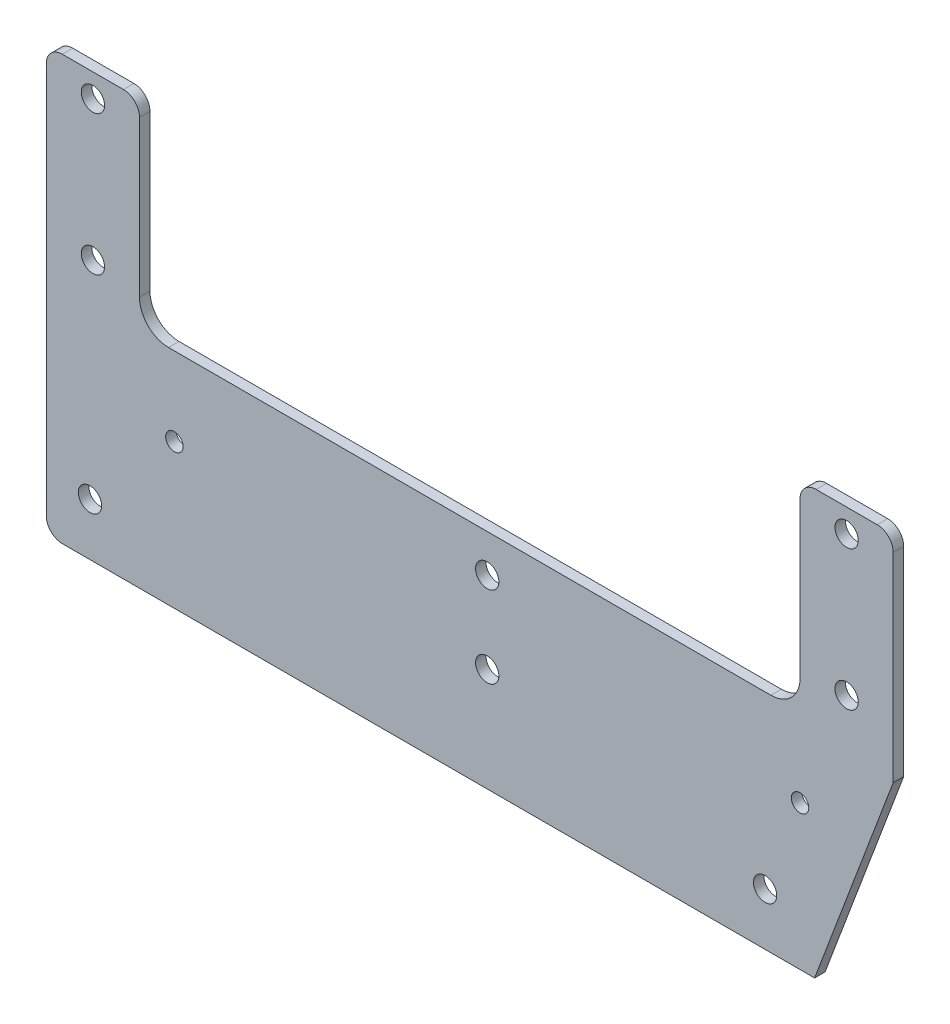
ISO-10303-21;
HEADER;
FILE_DESCRIPTION(('STEP AP214'),'2;1');
FILE_NAME('part.step','',(''),(''),'','','');
FILE_SCHEMA(('AUTOMOTIVE_DESIGN { 1 0 10303 214 1 1 1 1 }'));
ENDSEC;
DATA;
#1=APPLICATION_CONTEXT('core data for automotive mechanical design processes');
#2=APPLICATION_PROTOCOL_DEFINITION('international standard','automotive_design',2000,#1);
#3=PRODUCT_CONTEXT('',#1,'mechanical');
#4=PRODUCT('Part','Part','',(#3));
#5=PRODUCT_RELATED_PRODUCT_CATEGORY('part','',(#4));
#6=PRODUCT_DEFINITION_FORMATION('','',#4);
#7=PRODUCT_DEFINITION_CONTEXT('part definition',#1,'design');
#8=PRODUCT_DEFINITION('design','',#6,#7);
#9=PRODUCT_DEFINITION_SHAPE('','',#8);
#10=(LENGTH_UNIT() NAMED_UNIT(*) SI_UNIT(.MILLI.,.METRE.));
#11=(NAMED_UNIT(*) PLANE_ANGLE_UNIT() SI_UNIT($,.RADIAN.));
#12=(NAMED_UNIT(*) SI_UNIT($,.STERADIAN.) SOLID_ANGLE_UNIT());
#13=UNCERTAINTY_MEASURE_WITH_UNIT(LENGTH_MEASURE(1.E-05),#10,'distance_accuracy_value','');
#14=(GEOMETRIC_REPRESENTATION_CONTEXT(3) GLOBAL_UNCERTAINTY_ASSIGNED_CONTEXT((#13)) GLOBAL_UNIT_ASSIGNED_CONTEXT((#10,
#11,#12)) REPRESENTATION_CONTEXT('',''));
#15=CARTESIAN_POINT('',(0.,0.,0.));
#16=DIRECTION('',(0.,0.,1.));
#17=DIRECTION('',(1.,0.,0.));
#18=AXIS2_PLACEMENT_3D('',#15,#16,#17);
#19=CARTESIAN_POINT('',(0.,0.,1.8));
#20=DIRECTION('',(0.,0.,1.));
#21=DIRECTION('',(1.,0.,0.));
#22=AXIS2_PLACEMENT_3D('',#19,#20,#21);
#23=PLANE('',#22);
#24=CARTESIAN_POINT('',(-14.,44.,1.8));
#25=DIRECTION('',(0.,0.,1.));
#26=DIRECTION('',(1.,0.,0.));
#27=AXIS2_PLACEMENT_3D('',#24,#25,#26);
#28=CIRCLE('',#27,2.);
#29=CARTESIAN_POINT('',(-12.,44.,1.8));
#30=VERTEX_POINT('',#29);
#31=EDGE_CURVE('E620',#30,#30,#28,.T.);
#32=ORIENTED_EDGE('',*,*,#31,.F.);
#33=EDGE_LOOP('',(#32));
#34=FACE_BOUND('',#33,.T.);
#35=CARTESIAN_POINT('',(53.725,7.,1.8));
#36=DIRECTION('',(0.,0.,1.));
#37=DIRECTION('',(1.,0.,0.));
#38=AXIS2_PLACEMENT_3D('',#35,#36,#37);
#39=CIRCLE('',#38,2.);
#40=CARTESIAN_POINT('',(55.725,7.,1.8));
#41=VERTEX_POINT('',#40);
#42=EDGE_CURVE('E608',#41,#41,#39,.T.);
#43=ORIENTED_EDGE('',*,*,#42,.F.);
#44=EDGE_LOOP('',(#43));
#45=FACE_BOUND('',#44,.T.);
#46=CARTESIAN_POINT('',(101.45,-15.8,1.8));
#47=DIRECTION('',(0.,0.,1.));
#48=DIRECTION('',(1.,0.,0.));
#49=AXIS2_PLACEMENT_3D('',#46,#47,#48);
#50=CIRCLE('',#49,2.);
#51=CARTESIAN_POINT('',(103.45,-15.8,1.8));
#52=VERTEX_POINT('',#51);
#53=EDGE_CURVE('E596',#52,#52,#50,.T.);
#54=ORIENTED_EDGE('',*,*,#53,.F.);
#55=EDGE_LOOP('',(#54));
#56=FACE_BOUND('',#55,.T.);
#57=CARTESIAN_POINT('',(115.45,20.,1.8));
#58=DIRECTION('',(0.,0.,1.));
#59=DIRECTION('',(1.,0.,0.));
#60=AXIS2_PLACEMENT_3D('',#57,#58,#59);
#61=CIRCLE('',#60,2.);
#62=CARTESIAN_POINT('',(117.45,20.,1.8));
#63=VERTEX_POINT('',#62);
#64=EDGE_CURVE('E584',#63,#63,#61,.T.);
#65=ORIENTED_EDGE('',*,*,#64,.F.);
#66=EDGE_LOOP('',(#65));
#67=FACE_BOUND('',#66,.T.);
#68=CARTESIAN_POINT('',(107.45,0.,1.8));
#69=DIRECTION('',(0.,0.,1.));
#70=DIRECTION('',(1.,0.,0.));
#71=AXIS2_PLACEMENT_3D('',#68,#69,#70);
#72=CIRCLE('',#71,1.5);
#73=CARTESIAN_POINT('',(108.95,0.,1.8));
#74=VERTEX_POINT('',#73);
#75=EDGE_CURVE('E196',#74,#74,#72,.T.);
#76=ORIENTED_EDGE('',*,*,#75,.F.);
#77=EDGE_LOOP('',(#76));
#78=FACE_BOUND('',#77,.T.);
#79=DIRECTION('',(0.,1.,0.));
#80=VECTOR('',#79,1.);
#81=CARTESIAN_POINT('',(123.45,11.,1.8));
#82=LINE('',#81,#80);
#83=CARTESIAN_POINT('',(123.45,11.,1.8));
#84=VERTEX_POINT('',#83);
#85=CARTESIAN_POINT('',(123.45,45.25,1.8));
#86=VERTEX_POINT('',#85);
#87=EDGE_CURVE('E175',#84,#86,#82,.T.);
#88=ORIENTED_EDGE('',*,*,#87,.T.);
#89=CARTESIAN_POINT('',(120.7,45.25,1.8));
#90=DIRECTION('',(0.,0.,1.));
#91=DIRECTION('',(1.,0.,0.));
#92=AXIS2_PLACEMENT_3D('',#89,#90,#91);
#93=CIRCLE('',#92,2.75);
#94=CARTESIAN_POINT('',(120.7,48.,1.8));
#95=VERTEX_POINT('',#94);
#96=EDGE_CURVE('E241',#86,#95,#93,.T.);
#97=ORIENTED_EDGE('',*,*,#96,.T.);
#98=DIRECTION('',(-1.,0.,0.));
#99=VECTOR('',#98,1.);
#100=CARTESIAN_POINT('',(123.45,48.,1.8));
#101=LINE('',#100,#99);
#102=CARTESIAN_POINT('',(110.2,48.,1.8));
#103=VERTEX_POINT('',#102);
#104=EDGE_CURVE('E177',#95,#103,#101,.T.);
#105=ORIENTED_EDGE('',*,*,#104,.T.);
#106=CARTESIAN_POINT('',(110.2,45.25,1.8));
#107=DIRECTION('',(0.,0.,1.));
#108=DIRECTION('',(1.,0.,0.));
#109=AXIS2_PLACEMENT_3D('',#106,#107,#108);
#110=CIRCLE('',#109,2.75);
#111=CARTESIAN_POINT('',(107.45,45.25,1.8));
#112=VERTEX_POINT('',#111);
#113=EDGE_CURVE('E239',#103,#112,#110,.T.);
#114=ORIENTED_EDGE('',*,*,#113,.T.);
#115=DIRECTION('',(0.,-1.,0.));
#116=VECTOR('',#115,1.);
#117=CARTESIAN_POINT('',(107.45,48.,1.8));
#118=LINE('',#117,#116);
#119=CARTESIAN_POINT('',(107.45,18.5,1.8));
#120=VERTEX_POINT('',#119);
#121=EDGE_CURVE('E183',#112,#120,#118,.T.);
#122=ORIENTED_EDGE('',*,*,#121,.T.);
#123=CARTESIAN_POINT('',(102.45,18.5,1.8));
#124=DIRECTION('',(0.,0.,1.));
#125=DIRECTION('',(1.,0.,0.));
#126=AXIS2_PLACEMENT_3D('',#123,#124,#125);
#127=CIRCLE('',#126,5.);
#128=CARTESIAN_POINT('',(102.45,13.5,1.8));
#129=VERTEX_POINT('',#128);
#130=EDGE_CURVE('E11',#120,#129,#127,.F.);
#131=ORIENTED_EDGE('',*,*,#130,.T.);
#132=DIRECTION('',(-1.,0.,0.));
#133=VECTOR('',#132,1.);
#134=CARTESIAN_POINT('',(107.45,13.5,1.8));
#135=LINE('',#134,#133);
#136=CARTESIAN_POINT('',(-1.,13.5,1.8));
#137=VERTEX_POINT('',#136);
#138=EDGE_CURVE('E185',#129,#137,#135,.T.);
#139=ORIENTED_EDGE('',*,*,#138,.T.);
#140=CARTESIAN_POINT('',(-1.00000000000001,18.5,1.8));
#141=DIRECTION('',(0.,0.,1.));
#142=DIRECTION('',(1.,0.,0.));
#143=AXIS2_PLACEMENT_3D('',#140,#141,#142);
#144=CIRCLE('',#143,5.);
#145=CARTESIAN_POINT('',(-6.00000000000001,18.5,1.8));
#146=VERTEX_POINT('',#145);
#147=EDGE_CURVE('E272',#137,#146,#144,.F.);
#148=ORIENTED_EDGE('',*,*,#147,.T.);
#149=DIRECTION('',(0.,1.,0.));
#150=VECTOR('',#149,1.);
#151=CARTESIAN_POINT('',(-6.00000000000001,13.5,1.8));
#152=LINE('',#151,#150);
#153=CARTESIAN_POINT('',(-6.,45.25,1.8));
#154=VERTEX_POINT('',#153);
#155=EDGE_CURVE('E188',#146,#154,#152,.T.);
#156=ORIENTED_EDGE('',*,*,#155,.T.);
#157=CARTESIAN_POINT('',(-8.75,45.25,1.8));
#158=DIRECTION('',(0.,0.,1.));
#159=DIRECTION('',(1.,0.,0.));
#160=AXIS2_PLACEMENT_3D('',#157,#158,#159);
#161=CIRCLE('',#160,2.75);
#162=CARTESIAN_POINT('',(-8.75,48.,1.8));
#163=VERTEX_POINT('',#162);
#164=EDGE_CURVE('E237',#154,#163,#161,.T.);
#165=ORIENTED_EDGE('',*,*,#164,.T.);
#166=DIRECTION('',(-1.,0.,0.));
#167=VECTOR('',#166,1.);
#168=CARTESIAN_POINT('',(-6.,48.,1.8));
#169=LINE('',#168,#167);
#170=CARTESIAN_POINT('',(-19.25,48.,1.8));
#171=VERTEX_POINT('',#170);
#172=EDGE_CURVE('E190',#163,#171,#169,.T.);
#173=ORIENTED_EDGE('',*,*,#172,.T.);
#174=CARTESIAN_POINT('',(-19.25,45.25,1.8));
#175=DIRECTION('',(0.,0.,1.));
#176=DIRECTION('',(1.,0.,0.));
#177=AXIS2_PLACEMENT_3D('',#174,#175,#176);
#178=CIRCLE('',#177,2.75);
#179=CARTESIAN_POINT('',(-22.,45.25,1.8));
#180=VERTEX_POINT('',#179);
#181=EDGE_CURVE('E235',#171,#180,#178,.T.);
#182=ORIENTED_EDGE('',*,*,#181,.T.);
#183=DIRECTION('',(0.,-1.,0.));
#184=VECTOR('',#183,1.);
#185=CARTESIAN_POINT('',(-22.,48.,1.8));
#186=LINE('',#185,#184);
#187=CARTESIAN_POINT('',(-22.,-22.05,1.8));
#188=VERTEX_POINT('',#187);
#189=EDGE_CURVE('E160',#180,#188,#186,.T.);
#190=ORIENTED_EDGE('',*,*,#189,.T.);
#191=CARTESIAN_POINT('',(-19.25,-22.05,1.8));
#192=DIRECTION('',(0.,0.,1.));
#193=DIRECTION('',(1.,0.,0.));
#194=AXIS2_PLACEMENT_3D('',#191,#192,#193);
#195=CIRCLE('',#194,2.75);
#196=CARTESIAN_POINT('',(-19.25,-24.8,1.8));
#197=VERTEX_POINT('',#196);
#198=EDGE_CURVE('E156',#188,#197,#195,.T.);
#199=ORIENTED_EDGE('',*,*,#198,.T.);
#200=DIRECTION('',(1.,0.,0.));
#201=VECTOR('',#200,1.);
#202=CARTESIAN_POINT('',(-22.,-24.8,1.8));
#203=LINE('',#202,#201);
#204=CARTESIAN_POINT('',(109.95,-24.8,1.8));
#205=VERTEX_POINT('',#204);
#206=EDGE_CURVE('E147',#197,#205,#203,.T.);
#207=ORIENTED_EDGE('',*,*,#206,.T.);
#208=DIRECTION('',(0.352841408008284,0.935683141236782,0.));
#209=VECTOR('',#208,1.);
#210=CARTESIAN_POINT('',(109.95,-24.8,1.8));
#211=LINE('',#210,#209);
#212=EDGE_CURVE('E152',#205,#84,#211,.T.);
#213=ORIENTED_EDGE('',*,*,#212,.T.);
#214=EDGE_LOOP('',(#88,#97,#105,#114,#122,#131,#139,#148,#156,#165,#173,#182,#190,#199,#207,#213));
#215=FACE_BOUND('',#214,.T.);
#216=CARTESIAN_POINT('',(0.,0.,1.8));
#217=DIRECTION('',(0.,0.,1.));
#218=DIRECTION('',(1.,0.,0.));
#219=AXIS2_PLACEMENT_3D('',#216,#217,#218);
#220=CIRCLE('',#219,1.5);
#221=CARTESIAN_POINT('',(1.5,0.,1.8));
#222=VERTEX_POINT('',#221);
#223=EDGE_CURVE('E578',#222,#222,#220,.T.);
#224=ORIENTED_EDGE('',*,*,#223,.F.);
#225=EDGE_LOOP('',(#224));
#226=FACE_BOUND('',#225,.T.);
#227=CARTESIAN_POINT('',(-14.,20.,1.8));
#228=DIRECTION('',(0.,0.,1.));
#229=DIRECTION('',(1.,0.,0.));
#230=AXIS2_PLACEMENT_3D('',#227,#228,#229);
#231=CIRCLE('',#230,2.);
#232=CARTESIAN_POINT('',(-12.,20.,1.8));
#233=VERTEX_POINT('',#232);
#234=EDGE_CURVE('E590',#233,#233,#231,.T.);
#235=ORIENTED_EDGE('',*,*,#234,.F.);
#236=EDGE_LOOP('',(#235));
#237=FACE_BOUND('',#236,.T.);
#238=CARTESIAN_POINT('',(-14.5,-15.8,1.8));
#239=DIRECTION('',(0.,0.,1.));
#240=DIRECTION('',(1.,0.,0.));
#241=AXIS2_PLACEMENT_3D('',#238,#239,#240);
#242=CIRCLE('',#241,2.);
#243=CARTESIAN_POINT('',(-12.5,-15.8,1.8));
#244=VERTEX_POINT('',#243);
#245=EDGE_CURVE('E602',#244,#244,#242,.T.);
#246=ORIENTED_EDGE('',*,*,#245,.F.);
#247=EDGE_LOOP('',(#246));
#248=FACE_BOUND('',#247,.T.);
#249=CARTESIAN_POINT('',(115.45,44.,1.8));
#250=DIRECTION('',(0.,0.,1.));
#251=DIRECTION('',(1.,0.,0.));
#252=AXIS2_PLACEMENT_3D('',#249,#250,#251);
#253=CIRCLE('',#252,2.);
#254=CARTESIAN_POINT('',(117.45,44.,1.8));
#255=VERTEX_POINT('',#254);
#256=EDGE_CURVE('E614',#255,#255,#253,.T.);
#257=ORIENTED_EDGE('',*,*,#256,.F.);
#258=EDGE_LOOP('',(#257));
#259=FACE_BOUND('',#258,.T.);
#260=CARTESIAN_POINT('',(53.725,-7.,1.8));
#261=DIRECTION('',(0.,0.,1.));
#262=DIRECTION('',(-1.,0.,0.));
#263=AXIS2_PLACEMENT_3D('',#260,#261,#262);
#264=CIRCLE('',#263,2.);
#265=CARTESIAN_POINT('',(51.725,-7.,1.8));
#266=VERTEX_POINT('',#265);
#267=EDGE_CURVE('E626',#266,#266,#264,.T.);
#268=ORIENTED_EDGE('',*,*,#267,.F.);
#269=EDGE_LOOP('',(#268));
#270=FACE_BOUND('',#269,.T.);
#271=ADVANCED_FACE('F35',(#34,#45,#56,#67,#78,#215,#226,#237,#248,#259,#270),#23,.T.);
#272=CARTESIAN_POINT('',(0.,0.,0.));
#273=DIRECTION('',(0.,0.,1.));
#274=DIRECTION('',(1.,0.,0.));
#275=AXIS2_PLACEMENT_3D('',#272,#273,#274);
#276=PLANE('',#275);
#277=DIRECTION('',(-1.,0.,0.));
#278=VECTOR('',#277,1.);
#279=CARTESIAN_POINT('',(123.45,48.,0.));
#280=LINE('',#279,#278);
#281=CARTESIAN_POINT('',(120.7,48.,0.));
#282=VERTEX_POINT('',#281);
#283=CARTESIAN_POINT('',(110.2,48.,0.));
#284=VERTEX_POINT('',#283);
#285=EDGE_CURVE('E203',#282,#284,#280,.T.);
#286=ORIENTED_EDGE('',*,*,#285,.F.);
#287=CARTESIAN_POINT('',(120.7,45.25,0.));
#288=DIRECTION('',(0.,0.,1.));
#289=DIRECTION('',(1.,0.,0.));
#290=AXIS2_PLACEMENT_3D('',#287,#288,#289);
#291=CIRCLE('',#290,2.75);
#292=CARTESIAN_POINT('',(123.45,45.25,0.));
#293=VERTEX_POINT('',#292);
#294=EDGE_CURVE('E230',#282,#293,#291,.F.);
#295=ORIENTED_EDGE('',*,*,#294,.T.);
#296=DIRECTION('',(0.,1.,0.));
#297=VECTOR('',#296,1.);
#298=CARTESIAN_POINT('',(123.45,11.,0.));
#299=LINE('',#298,#297);
#300=CARTESIAN_POINT('',(123.45,11.,0.));
#301=VERTEX_POINT('',#300);
#302=EDGE_CURVE('E200',#301,#293,#299,.T.);
#303=ORIENTED_EDGE('',*,*,#302,.F.);
#304=DIRECTION('',(0.352841408008284,0.935683141236782,0.));
#305=VECTOR('',#304,1.);
#306=CARTESIAN_POINT('',(109.95,-24.8,0.));
#307=LINE('',#306,#305);
#308=CARTESIAN_POINT('',(109.95,-24.8,0.));
#309=VERTEX_POINT('',#308);
#310=EDGE_CURVE('E198',#309,#301,#307,.T.);
#311=ORIENTED_EDGE('',*,*,#310,.F.);
#312=DIRECTION('',(1.,0.,0.));
#313=VECTOR('',#312,1.);
#314=CARTESIAN_POINT('',(-22.,-24.8,0.));
#315=LINE('',#314,#313);
#316=CARTESIAN_POINT('',(-19.25,-24.8,0.));
#317=VERTEX_POINT('',#316);
#318=EDGE_CURVE('E166',#317,#309,#315,.T.);
#319=ORIENTED_EDGE('',*,*,#318,.F.);
#320=CARTESIAN_POINT('',(-19.25,-22.05,0.));
#321=DIRECTION('',(0.,0.,1.));
#322=DIRECTION('',(1.,0.,0.));
#323=AXIS2_PLACEMENT_3D('',#320,#321,#322);
#324=CIRCLE('',#323,2.75);
#325=CARTESIAN_POINT('',(-22.,-22.05,0.));
#326=VERTEX_POINT('',#325);
#327=EDGE_CURVE('E221',#317,#326,#324,.F.);
#328=ORIENTED_EDGE('',*,*,#327,.T.);
#329=DIRECTION('',(0.,-1.,0.));
#330=VECTOR('',#329,1.);
#331=CARTESIAN_POINT('',(-22.,48.,0.));
#332=LINE('',#331,#330);
#333=CARTESIAN_POINT('',(-22.,45.25,0.));
#334=VERTEX_POINT('',#333);
#335=EDGE_CURVE('E193',#334,#326,#332,.T.);
#336=ORIENTED_EDGE('',*,*,#335,.F.);
#337=CARTESIAN_POINT('',(-19.25,45.25,0.));
#338=DIRECTION('',(0.,0.,1.));
#339=DIRECTION('',(1.,0.,0.));
#340=AXIS2_PLACEMENT_3D('',#337,#338,#339);
#341=CIRCLE('',#340,2.75);
#342=CARTESIAN_POINT('',(-19.25,48.,0.));
#343=VERTEX_POINT('',#342);
#344=EDGE_CURVE('E223',#334,#343,#341,.F.);
#345=ORIENTED_EDGE('',*,*,#344,.T.);
#346=DIRECTION('',(-1.,0.,0.));
#347=VECTOR('',#346,1.);
#348=CARTESIAN_POINT('',(-6.,48.,0.));
#349=LINE('',#348,#347);
#350=CARTESIAN_POINT('',(-8.75,48.,0.));
#351=VERTEX_POINT('',#350);
#352=EDGE_CURVE('E213',#351,#343,#349,.T.);
#353=ORIENTED_EDGE('',*,*,#352,.F.);
#354=CARTESIAN_POINT('',(-8.75,45.25,0.));
#355=DIRECTION('',(0.,0.,1.));
#356=DIRECTION('',(1.,0.,0.));
#357=AXIS2_PLACEMENT_3D('',#354,#355,#356);
#358=CIRCLE('',#357,2.75);
#359=CARTESIAN_POINT('',(-6.,45.25,0.));
#360=VERTEX_POINT('',#359);
#361=EDGE_CURVE('E225',#351,#360,#358,.F.);
#362=ORIENTED_EDGE('',*,*,#361,.T.);
#363=DIRECTION('',(0.,1.,0.));
#364=VECTOR('',#363,1.);
#365=CARTESIAN_POINT('',(-6.00000000000001,13.5,0.));
#366=LINE('',#365,#364);
#367=CARTESIAN_POINT('',(-6.00000000000001,18.5,0.));
#368=VERTEX_POINT('',#367);
#369=EDGE_CURVE('E211',#368,#360,#366,.T.);
#370=ORIENTED_EDGE('',*,*,#369,.F.);
#371=CARTESIAN_POINT('',(-1.00000000000001,18.5,0.));
#372=DIRECTION('',(0.,0.,1.));
#373=DIRECTION('',(1.,0.,0.));
#374=AXIS2_PLACEMENT_3D('',#371,#372,#373);
#375=CIRCLE('',#374,5.);
#376=CARTESIAN_POINT('',(-1.,13.5,0.));
#377=VERTEX_POINT('',#376);
#378=EDGE_CURVE('E270',#368,#377,#375,.T.);
#379=ORIENTED_EDGE('',*,*,#378,.T.);
#380=DIRECTION('',(-1.,0.,0.));
#381=VECTOR('',#380,1.);
#382=CARTESIAN_POINT('',(107.45,13.5,0.));
#383=LINE('',#382,#381);
#384=CARTESIAN_POINT('',(102.45,13.5,0.));
#385=VERTEX_POINT('',#384);
#386=EDGE_CURVE('E208',#385,#377,#383,.T.);
#387=ORIENTED_EDGE('',*,*,#386,.F.);
#388=CARTESIAN_POINT('',(102.45,18.5,0.));
#389=DIRECTION('',(0.,0.,1.));
#390=DIRECTION('',(1.,0.,0.));
#391=AXIS2_PLACEMENT_3D('',#388,#389,#390);
#392=CIRCLE('',#391,5.);
#393=CARTESIAN_POINT('',(107.45,18.5,0.));
#394=VERTEX_POINT('',#393);
#395=EDGE_CURVE('E43',#385,#394,#392,.T.);
#396=ORIENTED_EDGE('',*,*,#395,.T.);
#397=DIRECTION('',(0.,-1.,0.));
#398=VECTOR('',#397,1.);
#399=CARTESIAN_POINT('',(107.45,48.,0.));
#400=LINE('',#399,#398);
#401=CARTESIAN_POINT('',(107.45,45.25,0.));
#402=VERTEX_POINT('',#401);
#403=EDGE_CURVE('E206',#402,#394,#400,.T.);
#404=ORIENTED_EDGE('',*,*,#403,.F.);
#405=CARTESIAN_POINT('',(110.2,45.25,0.));
#406=DIRECTION('',(0.,0.,1.));
#407=DIRECTION('',(1.,0.,0.));
#408=AXIS2_PLACEMENT_3D('',#405,#406,#407);
#409=CIRCLE('',#408,2.75);
#410=EDGE_CURVE('E228',#402,#284,#409,.F.);
#411=ORIENTED_EDGE('',*,*,#410,.T.);
#412=EDGE_LOOP('',(#286,#295,#303,#311,#319,#328,#336,#345,#353,#362,#370,#379,#387,#396,#404,#411));
#413=FACE_BOUND('',#412,.T.);
#414=CARTESIAN_POINT('',(107.45,0.,0.));
#415=DIRECTION('',(0.,0.,1.));
#416=DIRECTION('',(1.,0.,0.));
#417=AXIS2_PLACEMENT_3D('',#414,#415,#416);
#418=CIRCLE('',#417,1.5);
#419=CARTESIAN_POINT('',(108.95,0.,0.));
#420=VERTEX_POINT('',#419);
#421=EDGE_CURVE('E575',#420,#420,#418,.T.);
#422=ORIENTED_EDGE('',*,*,#421,.T.);
#423=EDGE_LOOP('',(#422));
#424=FACE_BOUND('',#423,.T.);
#425=CARTESIAN_POINT('',(0.,0.,0.));
#426=DIRECTION('',(0.,0.,1.));
#427=DIRECTION('',(1.,0.,0.));
#428=AXIS2_PLACEMENT_3D('',#425,#426,#427);
#429=CIRCLE('',#428,1.5);
#430=CARTESIAN_POINT('',(1.5,0.,0.));
#431=VERTEX_POINT('',#430);
#432=EDGE_CURVE('E581',#431,#431,#429,.T.);
#433=ORIENTED_EDGE('',*,*,#432,.T.);
#434=EDGE_LOOP('',(#433));
#435=FACE_BOUND('',#434,.T.);
#436=CARTESIAN_POINT('',(115.45,20.,0.));
#437=DIRECTION('',(0.,0.,1.));
#438=DIRECTION('',(1.,0.,0.));
#439=AXIS2_PLACEMENT_3D('',#436,#437,#438);
#440=CIRCLE('',#439,2.);
#441=CARTESIAN_POINT('',(117.45,20.,0.));
#442=VERTEX_POINT('',#441);
#443=EDGE_CURVE('E587',#442,#442,#440,.T.);
#444=ORIENTED_EDGE('',*,*,#443,.T.);
#445=EDGE_LOOP('',(#444));
#446=FACE_BOUND('',#445,.T.);
#447=CARTESIAN_POINT('',(-14.,20.,0.));
#448=DIRECTION('',(0.,0.,1.));
#449=DIRECTION('',(1.,0.,0.));
#450=AXIS2_PLACEMENT_3D('',#447,#448,#449);
#451=CIRCLE('',#450,2.);
#452=CARTESIAN_POINT('',(-12.,20.,0.));
#453=VERTEX_POINT('',#452);
#454=EDGE_CURVE('E593',#453,#453,#451,.T.);
#455=ORIENTED_EDGE('',*,*,#454,.T.);
#456=EDGE_LOOP('',(#455));
#457=FACE_BOUND('',#456,.T.);
#458=CARTESIAN_POINT('',(101.45,-15.8,0.));
#459=DIRECTION('',(0.,0.,1.));
#460=DIRECTION('',(1.,0.,0.));
#461=AXIS2_PLACEMENT_3D('',#458,#459,#460);
#462=CIRCLE('',#461,2.);
#463=CARTESIAN_POINT('',(103.45,-15.8,0.));
#464=VERTEX_POINT('',#463);
#465=EDGE_CURVE('E599',#464,#464,#462,.T.);
#466=ORIENTED_EDGE('',*,*,#465,.T.);
#467=EDGE_LOOP('',(#466));
#468=FACE_BOUND('',#467,.T.);
#469=CARTESIAN_POINT('',(-14.5,-15.8,0.));
#470=DIRECTION('',(0.,0.,1.));
#471=DIRECTION('',(1.,0.,0.));
#472=AXIS2_PLACEMENT_3D('',#469,#470,#471);
#473=CIRCLE('',#472,2.);
#474=CARTESIAN_POINT('',(-12.5,-15.8,0.));
#475=VERTEX_POINT('',#474);
#476=EDGE_CURVE('E605',#475,#475,#473,.T.);
#477=ORIENTED_EDGE('',*,*,#476,.T.);
#478=EDGE_LOOP('',(#477));
#479=FACE_BOUND('',#478,.T.);
#480=CARTESIAN_POINT('',(53.725,7.,0.));
#481=DIRECTION('',(0.,0.,1.));
#482=DIRECTION('',(1.,0.,0.));
#483=AXIS2_PLACEMENT_3D('',#480,#481,#482);
#484=CIRCLE('',#483,2.);
#485=CARTESIAN_POINT('',(55.725,7.,0.));
#486=VERTEX_POINT('',#485);
#487=EDGE_CURVE('E611',#486,#486,#484,.T.);
#488=ORIENTED_EDGE('',*,*,#487,.T.);
#489=EDGE_LOOP('',(#488));
#490=FACE_BOUND('',#489,.T.);
#491=CARTESIAN_POINT('',(115.45,44.,0.));
#492=DIRECTION('',(0.,0.,1.));
#493=DIRECTION('',(1.,0.,0.));
#494=AXIS2_PLACEMENT_3D('',#491,#492,#493);
#495=CIRCLE('',#494,2.);
#496=CARTESIAN_POINT('',(117.45,44.,0.));
#497=VERTEX_POINT('',#496);
#498=EDGE_CURVE('E617',#497,#497,#495,.T.);
#499=ORIENTED_EDGE('',*,*,#498,.T.);
#500=EDGE_LOOP('',(#499));
#501=FACE_BOUND('',#500,.T.);
#502=CARTESIAN_POINT('',(-14.,44.,0.));
#503=DIRECTION('',(0.,0.,1.));
#504=DIRECTION('',(1.,0.,0.));
#505=AXIS2_PLACEMENT_3D('',#502,#503,#504);
#506=CIRCLE('',#505,2.);
#507=CARTESIAN_POINT('',(-12.,44.,0.));
#508=VERTEX_POINT('',#507);
#509=EDGE_CURVE('E623',#508,#508,#506,.T.);
#510=ORIENTED_EDGE('',*,*,#509,.T.);
#511=EDGE_LOOP('',(#510));
#512=FACE_BOUND('',#511,.T.);
#513=CARTESIAN_POINT('',(53.725,-7.,0.));
#514=DIRECTION('',(0.,0.,1.));
#515=DIRECTION('',(-1.,0.,0.));
#516=AXIS2_PLACEMENT_3D('',#513,#514,#515);
#517=CIRCLE('',#516,2.);
#518=CARTESIAN_POINT('',(51.725,-7.,0.));
#519=VERTEX_POINT('',#518);
#520=EDGE_CURVE('E629',#519,#519,#517,.T.);
#521=ORIENTED_EDGE('',*,*,#520,.T.);
#522=EDGE_LOOP('',(#521));
#523=FACE_BOUND('',#522,.T.);
#524=ADVANCED_FACE('F286',(#413,#424,#435,#446,#457,#468,#479,#490,#501,#512,#523),#276,.F.);
#525=CARTESIAN_POINT('',(-22.,48.,1.8));
#526=DIRECTION('',(1.,0.,0.));
#527=DIRECTION('',(0.,1.,0.));
#528=AXIS2_PLACEMENT_3D('',#525,#526,#527);
#529=PLANE('',#528);
#530=ORIENTED_EDGE('',*,*,#189,.F.);
#531=DIRECTION('',(0.,0.,-1.));
#532=VECTOR('',#531,1.);
#533=CARTESIAN_POINT('',(-22.,45.25,1.8));
#534=LINE('',#533,#532);
#535=EDGE_CURVE('E256',#180,#334,#534,.T.);
#536=ORIENTED_EDGE('',*,*,#535,.T.);
#537=ORIENTED_EDGE('',*,*,#335,.T.);
#538=DIRECTION('',(0.,0.,-1.));
#539=VECTOR('',#538,1.);
#540=CARTESIAN_POINT('',(-22.,-22.05,1.8));
#541=LINE('',#540,#539);
#542=EDGE_CURVE('E254',#326,#188,#541,.F.);
#543=ORIENTED_EDGE('',*,*,#542,.T.);
#544=EDGE_LOOP('',(#530,#536,#537,#543));
#545=FACE_BOUND('',#544,.T.);
#546=ADVANCED_FACE('F324',(#545),#529,.F.);
#547=CARTESIAN_POINT('',(-22.,-24.8,1.8));
#548=DIRECTION('',(0.,1.,0.));
#549=DIRECTION('',(0.,0.,1.));
#550=AXIS2_PLACEMENT_3D('',#547,#548,#549);
#551=PLANE('',#550);
#552=ORIENTED_EDGE('',*,*,#206,.F.);
#553=DIRECTION('',(0.,0.,-1.));
#554=VECTOR('',#553,1.);
#555=CARTESIAN_POINT('',(-19.25,-24.8,1.8));
#556=LINE('',#555,#554);
#557=EDGE_CURVE('E259',#197,#317,#556,.T.);
#558=ORIENTED_EDGE('',*,*,#557,.T.);
#559=ORIENTED_EDGE('',*,*,#318,.T.);
#560=DIRECTION('',(0.,0.,-1.));
#561=VECTOR('',#560,1.);
#562=CARTESIAN_POINT('',(109.95,-24.8,1.8));
#563=LINE('',#562,#561);
#564=EDGE_CURVE('E163',#205,#309,#563,.T.);
#565=ORIENTED_EDGE('',*,*,#564,.F.);
#566=EDGE_LOOP('',(#552,#558,#559,#565));
#567=FACE_BOUND('',#566,.T.);
#568=ADVANCED_FACE('F164',(#567),#551,.F.);
#569=CARTESIAN_POINT('',(109.95,-24.8,1.8));
#570=DIRECTION('',(-0.935683141236782,0.352841408008284,0.));
#571=DIRECTION('',(-0.352841408008284,-0.935683141236782,0.));
#572=AXIS2_PLACEMENT_3D('',#569,#570,#571);
#573=PLANE('',#572);
#574=ORIENTED_EDGE('',*,*,#310,.T.);
#575=DIRECTION('',(0.,0.,-1.));
#576=VECTOR('',#575,1.);
#577=CARTESIAN_POINT('',(123.45,11.,1.8));
#578=LINE('',#577,#576);
#579=EDGE_CURVE('E170',#84,#301,#578,.T.);
#580=ORIENTED_EDGE('',*,*,#579,.F.);
#581=ORIENTED_EDGE('',*,*,#212,.F.);
#582=ORIENTED_EDGE('',*,*,#564,.T.);
#583=EDGE_LOOP('',(#574,#580,#581,#582));
#584=FACE_BOUND('',#583,.T.);
#585=ADVANCED_FACE('F172',(#584),#573,.F.);
#586=CARTESIAN_POINT('',(123.45,11.,1.8));
#587=DIRECTION('',(-1.,0.,0.));
#588=DIRECTION('',(0.,-1.,0.));
#589=AXIS2_PLACEMENT_3D('',#586,#587,#588);
#590=PLANE('',#589);
#591=ORIENTED_EDGE('',*,*,#302,.T.);
#592=DIRECTION('',(0.,0.,-1.));
#593=VECTOR('',#592,1.);
#594=CARTESIAN_POINT('',(123.45,45.25,1.8));
#595=LINE('',#594,#593);
#596=EDGE_CURVE('E232',#293,#86,#595,.F.);
#597=ORIENTED_EDGE('',*,*,#596,.T.);
#598=ORIENTED_EDGE('',*,*,#87,.F.);
#599=ORIENTED_EDGE('',*,*,#579,.T.);
#600=EDGE_LOOP('',(#591,#597,#598,#599));
#601=FACE_BOUND('',#600,.T.);
#602=ADVANCED_FACE('F309',(#601),#590,.F.);
#603=CARTESIAN_POINT('',(123.45,48.,1.8));
#604=DIRECTION('',(0.,-1.,0.));
#605=DIRECTION('',(0.,0.,-1.));
#606=AXIS2_PLACEMENT_3D('',#603,#604,#605);
#607=PLANE('',#606);
#608=ORIENTED_EDGE('',*,*,#104,.F.);
#609=DIRECTION('',(0.,0.,-1.));
#610=VECTOR('',#609,1.);
#611=CARTESIAN_POINT('',(120.7,48.,1.8));
#612=LINE('',#611,#610);
#613=EDGE_CURVE('E218',#95,#282,#612,.T.);
#614=ORIENTED_EDGE('',*,*,#613,.T.);
#615=ORIENTED_EDGE('',*,*,#285,.T.);
#616=DIRECTION('',(0.,0.,-1.));
#617=VECTOR('',#616,1.);
#618=CARTESIAN_POINT('',(110.2,48.,1.8));
#619=LINE('',#618,#617);
#620=EDGE_CURVE('E169',#284,#103,#619,.F.);
#621=ORIENTED_EDGE('',*,*,#620,.T.);
#622=EDGE_LOOP('',(#608,#614,#615,#621));
#623=FACE_BOUND('',#622,.T.);
#624=ADVANCED_FACE('F301',(#623),#607,.F.);
#625=CARTESIAN_POINT('',(107.45,48.,1.8));
#626=DIRECTION('',(1.,0.,0.));
#627=DIRECTION('',(0.,1.,0.));
#628=AXIS2_PLACEMENT_3D('',#625,#626,#627);
#629=PLANE('',#628);
#630=ORIENTED_EDGE('',*,*,#403,.T.);
#631=DIRECTION('',(0.,0.,-1.));
#632=VECTOR('',#631,1.);
#633=CARTESIAN_POINT('',(107.45,18.5,1.8));
#634=LINE('',#633,#632);
#635=EDGE_CURVE('E56',#394,#120,#634,.F.);
#636=ORIENTED_EDGE('',*,*,#635,.T.);
#637=ORIENTED_EDGE('',*,*,#121,.F.);
#638=DIRECTION('',(0.,0.,-1.));
#639=VECTOR('',#638,1.);
#640=CARTESIAN_POINT('',(107.45,45.25,1.8));
#641=LINE('',#640,#639);
#642=EDGE_CURVE('E243',#112,#402,#641,.T.);
#643=ORIENTED_EDGE('',*,*,#642,.T.);
#644=EDGE_LOOP('',(#630,#636,#637,#643));
#645=FACE_BOUND('',#644,.T.);
#646=ADVANCED_FACE('F295',(#645),#629,.F.);
#647=CARTESIAN_POINT('',(107.45,13.5,1.8));
#648=DIRECTION('',(0.,-1.,0.));
#649=DIRECTION('',(1.,0.,0.));
#650=AXIS2_PLACEMENT_3D('',#647,#648,#649);
#651=PLANE('',#650);
#652=ORIENTED_EDGE('',*,*,#386,.T.);
#653=DIRECTION('',(0.,0.,-1.));
#654=VECTOR('',#653,1.);
#655=CARTESIAN_POINT('',(-1.,13.5,1.8));
#656=LINE('',#655,#654);
#657=EDGE_CURVE('E267',#377,#137,#656,.F.);
#658=ORIENTED_EDGE('',*,*,#657,.T.);
#659=ORIENTED_EDGE('',*,*,#138,.F.);
#660=DIRECTION('',(0.,0.,-1.));
#661=VECTOR('',#660,1.);
#662=CARTESIAN_POINT('',(102.45,13.5,0.));
#663=LINE('',#662,#661);
#664=EDGE_CURVE('E264',#129,#385,#663,.T.);
#665=ORIENTED_EDGE('',*,*,#664,.T.);
#666=EDGE_LOOP('',(#652,#658,#659,#665));
#667=FACE_BOUND('',#666,.T.);
#668=ADVANCED_FACE('F289',(#667),#651,.F.);
#669=CARTESIAN_POINT('',(-6.00000000000001,13.5,1.8));
#670=DIRECTION('',(-1.,0.,0.));
#671=DIRECTION('',(0.,-1.,0.));
#672=AXIS2_PLACEMENT_3D('',#669,#670,#671);
#673=PLANE('',#672);
#674=ORIENTED_EDGE('',*,*,#155,.F.);
#675=DIRECTION('',(0.,0.,-1.));
#676=VECTOR('',#675,1.);
#677=CARTESIAN_POINT('',(-6.00000000000001,18.5,0.));
#678=LINE('',#677,#676);
#679=EDGE_CURVE('E261',#146,#368,#678,.T.);
#680=ORIENTED_EDGE('',*,*,#679,.T.);
#681=ORIENTED_EDGE('',*,*,#369,.T.);
#682=DIRECTION('',(0.,0.,-1.));
#683=VECTOR('',#682,1.);
#684=CARTESIAN_POINT('',(-6.,45.25,1.8));
#685=LINE('',#684,#683);
#686=EDGE_CURVE('E251',#360,#154,#685,.F.);
#687=ORIENTED_EDGE('',*,*,#686,.T.);
#688=EDGE_LOOP('',(#674,#680,#681,#687));
#689=FACE_BOUND('',#688,.T.);
#690=ADVANCED_FACE('F280',(#689),#673,.F.);
#691=CARTESIAN_POINT('',(-6.,48.,1.8));
#692=DIRECTION('',(0.,-1.,0.));
#693=DIRECTION('',(0.,0.,-1.));
#694=AXIS2_PLACEMENT_3D('',#691,#692,#693);
#695=PLANE('',#694);
#696=ORIENTED_EDGE('',*,*,#172,.F.);
#697=DIRECTION('',(0.,0.,-1.));
#698=VECTOR('',#697,1.);
#699=CARTESIAN_POINT('',(-8.75,48.,1.8));
#700=LINE('',#699,#698);
#701=EDGE_CURVE('E248',#163,#351,#700,.T.);
#702=ORIENTED_EDGE('',*,*,#701,.T.);
#703=ORIENTED_EDGE('',*,*,#352,.T.);
#704=DIRECTION('',(0.,0.,-1.));
#705=VECTOR('',#704,1.);
#706=CARTESIAN_POINT('',(-19.25,48.,1.8));
#707=LINE('',#706,#705);
#708=EDGE_CURVE('E246',#343,#171,#707,.F.);
#709=ORIENTED_EDGE('',*,*,#708,.T.);
#710=EDGE_LOOP('',(#696,#702,#703,#709));
#711=FACE_BOUND('',#710,.T.);
#712=ADVANCED_FACE('F332',(#711),#695,.F.);
#713=CARTESIAN_POINT('',(107.45,0.,1.8));
#714=DIRECTION('',(0.,0.,-1.));
#715=DIRECTION('',(-1.,0.,0.));
#716=AXIS2_PLACEMENT_3D('',#713,#714,#715);
#717=CYLINDRICAL_SURFACE('',#716,1.5);
#718=ORIENTED_EDGE('',*,*,#75,.T.);
#719=EDGE_LOOP('',(#718));
#720=FACE_BOUND('',#719,.T.);
#721=ORIENTED_EDGE('',*,*,#421,.F.);
#722=EDGE_LOOP('',(#721));
#723=FACE_BOUND('',#722,.T.);
#724=ADVANCED_FACE('F329',(#720,#723),#717,.F.);
#725=CARTESIAN_POINT('',(0.,0.,1.8));
#726=DIRECTION('',(0.,0.,-1.));
#727=DIRECTION('',(-1.,0.,0.));
#728=AXIS2_PLACEMENT_3D('',#725,#726,#727);
#729=CYLINDRICAL_SURFACE('',#728,1.5);
#730=ORIENTED_EDGE('',*,*,#223,.T.);
#731=EDGE_LOOP('',(#730));
#732=FACE_BOUND('',#731,.T.);
#733=ORIENTED_EDGE('',*,*,#432,.F.);
#734=EDGE_LOOP('',(#733));
#735=FACE_BOUND('',#734,.T.);
#736=ADVANCED_FACE('F366',(#732,#735),#729,.F.);
#737=CARTESIAN_POINT('',(115.45,20.,1.8));
#738=DIRECTION('',(0.,0.,-1.));
#739=DIRECTION('',(-1.,0.,0.));
#740=AXIS2_PLACEMENT_3D('',#737,#738,#739);
#741=CYLINDRICAL_SURFACE('',#740,2.);
#742=ORIENTED_EDGE('',*,*,#64,.T.);
#743=EDGE_LOOP('',(#742));
#744=FACE_BOUND('',#743,.T.);
#745=ORIENTED_EDGE('',*,*,#443,.F.);
#746=EDGE_LOOP('',(#745));
#747=FACE_BOUND('',#746,.T.);
#748=ADVANCED_FACE('F374',(#744,#747),#741,.F.);
#749=CARTESIAN_POINT('',(-14.,20.,1.8));
#750=DIRECTION('',(0.,0.,-1.));
#751=DIRECTION('',(-1.,0.,0.));
#752=AXIS2_PLACEMENT_3D('',#749,#750,#751);
#753=CYLINDRICAL_SURFACE('',#752,2.);
#754=ORIENTED_EDGE('',*,*,#234,.T.);
#755=EDGE_LOOP('',(#754));
#756=FACE_BOUND('',#755,.T.);
#757=ORIENTED_EDGE('',*,*,#454,.F.);
#758=EDGE_LOOP('',(#757));
#759=FACE_BOUND('',#758,.T.);
#760=ADVANCED_FACE('F381',(#756,#759),#753,.F.);
#761=CARTESIAN_POINT('',(101.45,-15.8,1.8));
#762=DIRECTION('',(0.,0.,-1.));
#763=DIRECTION('',(-1.,0.,0.));
#764=AXIS2_PLACEMENT_3D('',#761,#762,#763);
#765=CYLINDRICAL_SURFACE('',#764,2.);
#766=ORIENTED_EDGE('',*,*,#53,.T.);
#767=EDGE_LOOP('',(#766));
#768=FACE_BOUND('',#767,.T.);
#769=ORIENTED_EDGE('',*,*,#465,.F.);
#770=EDGE_LOOP('',(#769));
#771=FACE_BOUND('',#770,.T.);
#772=ADVANCED_FACE('F389',(#768,#771),#765,.F.);
#773=CARTESIAN_POINT('',(-14.5,-15.8,1.8));
#774=DIRECTION('',(0.,0.,-1.));
#775=DIRECTION('',(-1.,0.,0.));
#776=AXIS2_PLACEMENT_3D('',#773,#774,#775);
#777=CYLINDRICAL_SURFACE('',#776,2.);
#778=ORIENTED_EDGE('',*,*,#245,.T.);
#779=EDGE_LOOP('',(#778));
#780=FACE_BOUND('',#779,.T.);
#781=ORIENTED_EDGE('',*,*,#476,.F.);
#782=EDGE_LOOP('',(#781));
#783=FACE_BOUND('',#782,.T.);
#784=ADVANCED_FACE('F397',(#780,#783),#777,.F.);
#785=CARTESIAN_POINT('',(53.725,7.,1.8));
#786=DIRECTION('',(0.,0.,-1.));
#787=DIRECTION('',(-1.,0.,0.));
#788=AXIS2_PLACEMENT_3D('',#785,#786,#787);
#789=CYLINDRICAL_SURFACE('',#788,2.);
#790=ORIENTED_EDGE('',*,*,#42,.T.);
#791=EDGE_LOOP('',(#790));
#792=FACE_BOUND('',#791,.T.);
#793=ORIENTED_EDGE('',*,*,#487,.F.);
#794=EDGE_LOOP('',(#793));
#795=FACE_BOUND('',#794,.T.);
#796=ADVANCED_FACE('F405',(#792,#795),#789,.F.);
#797=CARTESIAN_POINT('',(115.45,44.,1.8));
#798=DIRECTION('',(0.,0.,-1.));
#799=DIRECTION('',(-1.,0.,0.));
#800=AXIS2_PLACEMENT_3D('',#797,#798,#799);
#801=CYLINDRICAL_SURFACE('',#800,2.);
#802=ORIENTED_EDGE('',*,*,#256,.T.);
#803=EDGE_LOOP('',(#802));
#804=FACE_BOUND('',#803,.T.);
#805=ORIENTED_EDGE('',*,*,#498,.F.);
#806=EDGE_LOOP('',(#805));
#807=FACE_BOUND('',#806,.T.);
#808=ADVANCED_FACE('F413',(#804,#807),#801,.F.);
#809=CARTESIAN_POINT('',(-14.,44.,1.8));
#810=DIRECTION('',(0.,0.,-1.));
#811=DIRECTION('',(-1.,0.,0.));
#812=AXIS2_PLACEMENT_3D('',#809,#810,#811);
#813=CYLINDRICAL_SURFACE('',#812,2.);
#814=ORIENTED_EDGE('',*,*,#31,.T.);
#815=EDGE_LOOP('',(#814));
#816=FACE_BOUND('',#815,.T.);
#817=ORIENTED_EDGE('',*,*,#509,.F.);
#818=EDGE_LOOP('',(#817));
#819=FACE_BOUND('',#818,.T.);
#820=ADVANCED_FACE('F421',(#816,#819),#813,.F.);
#821=CARTESIAN_POINT('',(53.725,-7.,1.8));
#822=DIRECTION('',(0.,0.,-1.));
#823=DIRECTION('',(-1.,0.,0.));
#824=AXIS2_PLACEMENT_3D('',#821,#822,#823);
#825=CYLINDRICAL_SURFACE('',#824,2.);
#826=ORIENTED_EDGE('',*,*,#267,.T.);
#827=EDGE_LOOP('',(#826));
#828=FACE_BOUND('',#827,.T.);
#829=ORIENTED_EDGE('',*,*,#520,.F.);
#830=EDGE_LOOP('',(#829));
#831=FACE_BOUND('',#830,.T.);
#832=ADVANCED_FACE('F429',(#828,#831),#825,.F.);
#833=CARTESIAN_POINT('',(120.7,45.25,1.8));
#834=DIRECTION('',(0.,0.,-1.));
#835=DIRECTION('',(-1.,0.,0.));
#836=AXIS2_PLACEMENT_3D('',#833,#834,#835);
#837=CYLINDRICAL_SURFACE('',#836,2.75);
#838=ORIENTED_EDGE('',*,*,#96,.F.);
#839=ORIENTED_EDGE('',*,*,#596,.F.);
#840=ORIENTED_EDGE('',*,*,#294,.F.);
#841=ORIENTED_EDGE('',*,*,#613,.F.);
#842=EDGE_LOOP('',(#838,#839,#840,#841));
#843=FACE_BOUND('',#842,.T.);
#844=ADVANCED_FACE('F305',(#843),#837,.T.);
#845=CARTESIAN_POINT('',(110.2,45.25,1.8));
#846=DIRECTION('',(0.,0.,-1.));
#847=DIRECTION('',(-1.,0.,0.));
#848=AXIS2_PLACEMENT_3D('',#845,#846,#847);
#849=CYLINDRICAL_SURFACE('',#848,2.75);
#850=ORIENTED_EDGE('',*,*,#113,.F.);
#851=ORIENTED_EDGE('',*,*,#620,.F.);
#852=ORIENTED_EDGE('',*,*,#410,.F.);
#853=ORIENTED_EDGE('',*,*,#642,.F.);
#854=EDGE_LOOP('',(#850,#851,#852,#853));
#855=FACE_BOUND('',#854,.T.);
#856=ADVANCED_FACE('F297',(#855),#849,.T.);
#857=CARTESIAN_POINT('',(-8.75,45.25,1.8));
#858=DIRECTION('',(0.,0.,-1.));
#859=DIRECTION('',(-1.,0.,0.));
#860=AXIS2_PLACEMENT_3D('',#857,#858,#859);
#861=CYLINDRICAL_SURFACE('',#860,2.75);
#862=ORIENTED_EDGE('',*,*,#164,.F.);
#863=ORIENTED_EDGE('',*,*,#686,.F.);
#864=ORIENTED_EDGE('',*,*,#361,.F.);
#865=ORIENTED_EDGE('',*,*,#701,.F.);
#866=EDGE_LOOP('',(#862,#863,#864,#865));
#867=FACE_BOUND('',#866,.T.);
#868=ADVANCED_FACE('F450',(#867),#861,.T.);
#869=CARTESIAN_POINT('',(-19.25,45.25,1.8));
#870=DIRECTION('',(0.,0.,-1.));
#871=DIRECTION('',(-1.,0.,0.));
#872=AXIS2_PLACEMENT_3D('',#869,#870,#871);
#873=CYLINDRICAL_SURFACE('',#872,2.75);
#874=ORIENTED_EDGE('',*,*,#181,.F.);
#875=ORIENTED_EDGE('',*,*,#708,.F.);
#876=ORIENTED_EDGE('',*,*,#344,.F.);
#877=ORIENTED_EDGE('',*,*,#535,.F.);
#878=EDGE_LOOP('',(#874,#875,#876,#877));
#879=FACE_BOUND('',#878,.T.);
#880=ADVANCED_FACE('F457',(#879),#873,.T.);
#881=CARTESIAN_POINT('',(-19.25,-22.05,1.8));
#882=DIRECTION('',(0.,0.,-1.));
#883=DIRECTION('',(-1.,0.,0.));
#884=AXIS2_PLACEMENT_3D('',#881,#882,#883);
#885=CYLINDRICAL_SURFACE('',#884,2.75);
#886=ORIENTED_EDGE('',*,*,#198,.F.);
#887=ORIENTED_EDGE('',*,*,#542,.F.);
#888=ORIENTED_EDGE('',*,*,#327,.F.);
#889=ORIENTED_EDGE('',*,*,#557,.F.);
#890=EDGE_LOOP('',(#886,#887,#888,#889));
#891=FACE_BOUND('',#890,.T.);
#892=ADVANCED_FACE('F465',(#891),#885,.T.);
#893=CARTESIAN_POINT('',(-1.00000000000001,18.5,1.8));
#894=DIRECTION('',(0.,0.,1.));
#895=DIRECTION('',(1.,0.,0.));
#896=AXIS2_PLACEMENT_3D('',#893,#894,#895);
#897=CYLINDRICAL_SURFACE('',#896,5.);
#898=ORIENTED_EDGE('',*,*,#147,.F.);
#899=ORIENTED_EDGE('',*,*,#657,.F.);
#900=ORIENTED_EDGE('',*,*,#378,.F.);
#901=ORIENTED_EDGE('',*,*,#679,.F.);
#902=EDGE_LOOP('',(#898,#899,#900,#901));
#903=FACE_BOUND('',#902,.T.);
#904=ADVANCED_FACE('F284',(#903),#897,.F.);
#905=CARTESIAN_POINT('',(102.45,18.5,1.8));
#906=DIRECTION('',(0.,0.,1.));
#907=DIRECTION('',(1.,0.,0.));
#908=AXIS2_PLACEMENT_3D('',#905,#906,#907);
#909=CYLINDRICAL_SURFACE('',#908,5.);
#910=ORIENTED_EDGE('',*,*,#130,.F.);
#911=ORIENTED_EDGE('',*,*,#635,.F.);
#912=ORIENTED_EDGE('',*,*,#395,.F.);
#913=ORIENTED_EDGE('',*,*,#664,.F.);
#914=EDGE_LOOP('',(#910,#911,#912,#913));
#915=FACE_BOUND('',#914,.T.);
#916=ADVANCED_FACE('F37',(#915),#909,.F.);
#917=CLOSED_SHELL('',(#271,#524,#546,#568,#585,#602,#624,#646,#668,#690,#712,#724,#736,#748,
#760,#772,#784,#796,#808,#820,#832,#844,#856,#868,#880,#892,#904,#916));
#918=MANIFOLD_SOLID_BREP('B2',#917);
#919=ADVANCED_BREP_SHAPE_REPRESENTATION('',(#18,#918),#14);
#920=SHAPE_DEFINITION_REPRESENTATION(#9,#919);
ENDSEC;
END-ISO-10303-21;
